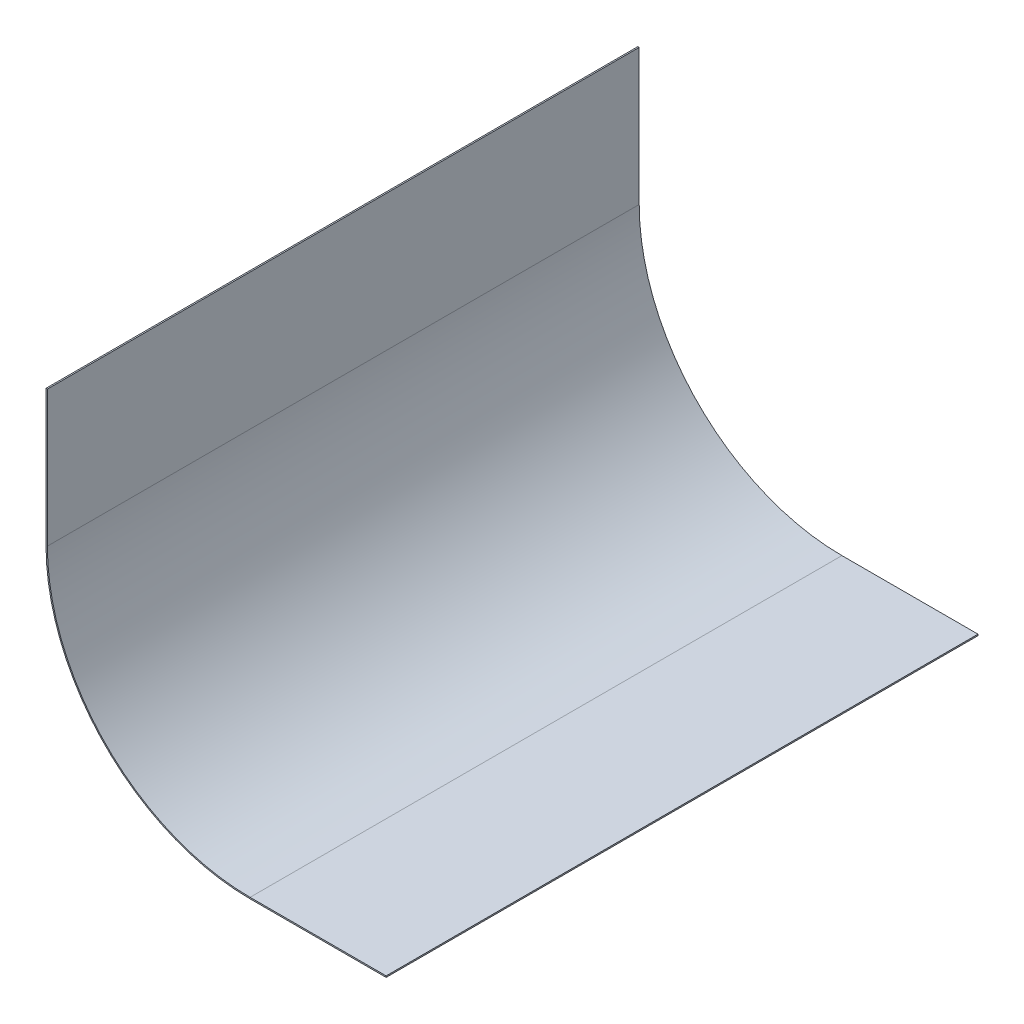
ISO-10303-21;
HEADER;
FILE_DESCRIPTION(('STEP AP214'),'2;1');
FILE_NAME('part.step','',(''),(''),'','','');
FILE_SCHEMA(('AUTOMOTIVE_DESIGN { 1 0 10303 214 1 1 1 1 }'));
ENDSEC;
DATA;
#1=APPLICATION_CONTEXT('core data for automotive mechanical design processes');
#2=APPLICATION_PROTOCOL_DEFINITION('international standard','automotive_design',2000,#1);
#3=PRODUCT_CONTEXT('',#1,'mechanical');
#4=PRODUCT('Part','Part','',(#3));
#5=PRODUCT_RELATED_PRODUCT_CATEGORY('part','',(#4));
#6=PRODUCT_DEFINITION_FORMATION('','',#4);
#7=PRODUCT_DEFINITION_CONTEXT('part definition',#1,'design');
#8=PRODUCT_DEFINITION('design','',#6,#7);
#9=PRODUCT_DEFINITION_SHAPE('','',#8);
#10=(LENGTH_UNIT() NAMED_UNIT(*) SI_UNIT(.MILLI.,.METRE.));
#11=(NAMED_UNIT(*) PLANE_ANGLE_UNIT() SI_UNIT($,.RADIAN.));
#12=(NAMED_UNIT(*) SI_UNIT($,.STERADIAN.) SOLID_ANGLE_UNIT());
#13=UNCERTAINTY_MEASURE_WITH_UNIT(LENGTH_MEASURE(1.E-05),#10,'distance_accuracy_value','');
#14=(GEOMETRIC_REPRESENTATION_CONTEXT(3) GLOBAL_UNCERTAINTY_ASSIGNED_CONTEXT((#13)) GLOBAL_UNIT_ASSIGNED_CONTEXT((#10,
#11,#12)) REPRESENTATION_CONTEXT('',''));
#15=CARTESIAN_POINT('',(0.,0.,0.));
#16=DIRECTION('',(0.,0.,1.));
#17=DIRECTION('',(1.,0.,0.));
#18=AXIS2_PLACEMENT_3D('',#15,#16,#17);
#19=CARTESIAN_POINT('',(-41.8969359331477,250.,490.));
#20=DIRECTION('',(0.,-1.,0.));
#21=DIRECTION('',(0.,0.,-1.));
#22=AXIS2_PLACEMENT_3D('',#19,#20,#21);
#23=PLANE('',#22);
#24=DIRECTION('',(-1.,0.,0.));
#25=VECTOR('',#24,1.);
#26=CARTESIAN_POINT('',(-41.8969359331477,250.,435.));
#27=LINE('',#26,#25);
#28=CARTESIAN_POINT('',(-41.8969359331477,250.,435.));
#29=VERTEX_POINT('',#28);
#30=CARTESIAN_POINT('',(-42.8969359331476,250.,435.));
#31=VERTEX_POINT('',#30);
#32=EDGE_CURVE('E98',#29,#31,#27,.T.);
#33=ORIENTED_EDGE('',*,*,#32,.F.);
#34=DIRECTION('',(0.,0.,-1.));
#35=VECTOR('',#34,1.);
#36=CARTESIAN_POINT('',(-41.8969359331477,250.,490.));
#37=LINE('',#36,#35);
#38=CARTESIAN_POINT('',(-41.8969359331477,250.,0.));
#39=VERTEX_POINT('',#38);
#40=EDGE_CURVE('E56',#29,#39,#37,.T.);
#41=ORIENTED_EDGE('',*,*,#40,.T.);
#42=DIRECTION('',(-1.,0.,0.));
#43=VECTOR('',#42,1.);
#44=CARTESIAN_POINT('',(-41.8969359331477,250.,0.));
#45=LINE('',#44,#43);
#46=CARTESIAN_POINT('',(-42.8969359331476,250.,0.));
#47=VERTEX_POINT('',#46);
#48=EDGE_CURVE('E103',#39,#47,#45,.T.);
#49=ORIENTED_EDGE('',*,*,#48,.T.);
#50=DIRECTION('',(0.,0.,-1.));
#51=VECTOR('',#50,1.);
#52=CARTESIAN_POINT('',(-42.8969359331476,250.,490.));
#53=LINE('',#52,#51);
#54=EDGE_CURVE('E42',#31,#47,#53,.T.);
#55=ORIENTED_EDGE('',*,*,#54,.F.);
#56=EDGE_LOOP('',(#33,#41,#49,#55));
#57=FACE_BOUND('',#56,.T.);
#58=ADVANCED_FACE('F35',(#57),#23,.F.);
#59=CARTESIAN_POINT('',(-42.8969359331476,250.,490.));
#60=DIRECTION('',(1.,0.,0.));
#61=DIRECTION('',(0.,1.,0.));
#62=AXIS2_PLACEMENT_3D('',#59,#60,#61);
#63=PLANE('',#62);
#64=DIRECTION('',(0.,-1.,0.));
#65=VECTOR('',#64,1.);
#66=CARTESIAN_POINT('',(-42.8969359331476,250.,435.));
#67=LINE('',#66,#65);
#68=CARTESIAN_POINT('',(-42.8969359331476,150.000000000001,435.));
#69=VERTEX_POINT('',#68);
#70=EDGE_CURVE('E104',#31,#69,#67,.T.);
#71=ORIENTED_EDGE('',*,*,#70,.F.);
#72=ORIENTED_EDGE('',*,*,#54,.T.);
#73=DIRECTION('',(0.,-1.,0.));
#74=VECTOR('',#73,1.);
#75=CARTESIAN_POINT('',(-42.8969359331476,250.,0.));
#76=LINE('',#75,#74);
#77=CARTESIAN_POINT('',(-42.8969359331476,150.000000000001,0.));
#78=VERTEX_POINT('',#77);
#79=EDGE_CURVE('E131',#47,#78,#76,.T.);
#80=ORIENTED_EDGE('',*,*,#79,.T.);
#81=DIRECTION('',(0.,0.,-1.));
#82=VECTOR('',#81,1.);
#83=CARTESIAN_POINT('',(-42.8969359331476,150.000000000001,490.));
#84=LINE('',#83,#82);
#85=EDGE_CURVE('E125',#69,#78,#84,.T.);
#86=ORIENTED_EDGE('',*,*,#85,.F.);
#87=EDGE_LOOP('',(#71,#72,#80,#86));
#88=FACE_BOUND('',#87,.T.);
#89=ADVANCED_FACE('F129',(#88),#63,.F.);
#90=CARTESIAN_POINT('',(107.103064066852,150.,490.));
#91=DIRECTION('',(0.,0.,-1.));
#92=DIRECTION('',(-1.,0.,0.));
#93=AXIS2_PLACEMENT_3D('',#90,#91,#92);
#94=CYLINDRICAL_SURFACE('',#93,150.);
#95=CARTESIAN_POINT('',(107.103064066852,150.,435.));
#96=DIRECTION('',(0.,0.,1.));
#97=DIRECTION('',(1.,0.,0.));
#98=AXIS2_PLACEMENT_3D('',#95,#96,#97);
#99=CIRCLE('',#98,150.);
#100=CARTESIAN_POINT('',(107.103064066853,0.,435.));
#101=VERTEX_POINT('',#100);
#102=EDGE_CURVE('E176',#69,#101,#99,.T.);
#103=ORIENTED_EDGE('',*,*,#102,.F.);
#104=ORIENTED_EDGE('',*,*,#85,.T.);
#105=CARTESIAN_POINT('',(107.103064066852,150.,0.));
#106=DIRECTION('',(0.,0.,1.));
#107=DIRECTION('',(-1.,0.,0.));
#108=AXIS2_PLACEMENT_3D('',#105,#106,#107);
#109=CIRCLE('',#108,150.);
#110=CARTESIAN_POINT('',(107.103064066853,0.,0.));
#111=VERTEX_POINT('',#110);
#112=EDGE_CURVE('E137',#78,#111,#109,.T.);
#113=ORIENTED_EDGE('',*,*,#112,.T.);
#114=DIRECTION('',(0.,0.,-1.));
#115=VECTOR('',#114,1.);
#116=CARTESIAN_POINT('',(107.103064066853,0.,490.));
#117=LINE('',#116,#115);
#118=EDGE_CURVE('E123',#101,#111,#117,.T.);
#119=ORIENTED_EDGE('',*,*,#118,.F.);
#120=EDGE_LOOP('',(#103,#104,#113,#119));
#121=FACE_BOUND('',#120,.T.);
#122=ADVANCED_FACE('F175',(#121),#94,.T.);
#123=CARTESIAN_POINT('',(107.103064066853,0.,490.));
#124=DIRECTION('',(0.,1.,0.));
#125=DIRECTION('',(0.,0.,1.));
#126=AXIS2_PLACEMENT_3D('',#123,#124,#125);
#127=PLANE('',#126);
#128=DIRECTION('',(1.,0.,0.));
#129=VECTOR('',#128,1.);
#130=CARTESIAN_POINT('',(107.103064066853,0.,435.));
#131=LINE('',#130,#129);
#132=CARTESIAN_POINT('',(207.103064066852,0.,435.));
#133=VERTEX_POINT('',#132);
#134=EDGE_CURVE('E172',#101,#133,#131,.T.);
#135=ORIENTED_EDGE('',*,*,#134,.F.);
#136=ORIENTED_EDGE('',*,*,#118,.T.);
#137=DIRECTION('',(1.,0.,0.));
#138=VECTOR('',#137,1.);
#139=CARTESIAN_POINT('',(107.103064066853,0.,0.));
#140=LINE('',#139,#138);
#141=CARTESIAN_POINT('',(207.103064066852,0.,0.));
#142=VERTEX_POINT('',#141);
#143=EDGE_CURVE('E143',#111,#142,#140,.T.);
#144=ORIENTED_EDGE('',*,*,#143,.T.);
#145=DIRECTION('',(0.,0.,-1.));
#146=VECTOR('',#145,1.);
#147=CARTESIAN_POINT('',(207.103064066852,0.,490.));
#148=LINE('',#147,#146);
#149=EDGE_CURVE('E121',#133,#142,#148,.T.);
#150=ORIENTED_EDGE('',*,*,#149,.F.);
#151=EDGE_LOOP('',(#135,#136,#144,#150));
#152=FACE_BOUND('',#151,.T.);
#153=ADVANCED_FACE('F170',(#152),#127,.F.);
#154=CARTESIAN_POINT('',(207.103064066852,0.999999999999999,490.));
#155=DIRECTION('',(-1.,0.,0.));
#156=DIRECTION('',(0.,-1.,0.));
#157=AXIS2_PLACEMENT_3D('',#154,#155,#156);
#158=PLANE('',#157);
#159=DIRECTION('',(0.,1.,0.));
#160=VECTOR('',#159,1.);
#161=CARTESIAN_POINT('',(207.103064066852,0.999999999999999,435.));
#162=LINE('',#161,#160);
#163=CARTESIAN_POINT('',(207.103064066852,0.999999999999999,435.));
#164=VERTEX_POINT('',#163);
#165=EDGE_CURVE('E167',#133,#164,#162,.T.);
#166=ORIENTED_EDGE('',*,*,#165,.F.);
#167=ORIENTED_EDGE('',*,*,#149,.T.);
#168=DIRECTION('',(0.,1.,0.));
#169=VECTOR('',#168,1.);
#170=CARTESIAN_POINT('',(207.103064066852,0.999999999999999,0.));
#171=LINE('',#170,#169);
#172=CARTESIAN_POINT('',(207.103064066852,0.999999999999999,0.));
#173=VERTEX_POINT('',#172);
#174=EDGE_CURVE('E146',#142,#173,#171,.T.);
#175=ORIENTED_EDGE('',*,*,#174,.T.);
#176=DIRECTION('',(0.,0.,-1.));
#177=VECTOR('',#176,1.);
#178=CARTESIAN_POINT('',(207.103064066852,0.999999999999999,490.));
#179=LINE('',#178,#177);
#180=EDGE_CURVE('E119',#164,#173,#179,.T.);
#181=ORIENTED_EDGE('',*,*,#180,.F.);
#182=EDGE_LOOP('',(#166,#167,#175,#181));
#183=FACE_BOUND('',#182,.T.);
#184=ADVANCED_FACE('F165',(#183),#158,.F.);
#185=CARTESIAN_POINT('',(107.103064066852,1.,490.));
#186=DIRECTION('',(0.,-1.,0.));
#187=DIRECTION('',(1.,0.,0.));
#188=AXIS2_PLACEMENT_3D('',#185,#186,#187);
#189=PLANE('',#188);
#190=DIRECTION('',(-1.,0.,0.));
#191=VECTOR('',#190,1.);
#192=CARTESIAN_POINT('',(107.103064066852,1.,435.));
#193=LINE('',#192,#191);
#194=CARTESIAN_POINT('',(107.103064066852,0.999999999999973,435.));
#195=VERTEX_POINT('',#194);
#196=EDGE_CURVE('E162',#164,#195,#193,.T.);
#197=ORIENTED_EDGE('',*,*,#196,.F.);
#198=ORIENTED_EDGE('',*,*,#180,.T.);
#199=DIRECTION('',(-1.,0.,0.));
#200=VECTOR('',#199,1.);
#201=CARTESIAN_POINT('',(107.103064066852,1.,0.));
#202=LINE('',#201,#200);
#203=CARTESIAN_POINT('',(107.103064066852,1.,0.));
#204=VERTEX_POINT('',#203);
#205=EDGE_CURVE('E149',#173,#204,#202,.T.);
#206=ORIENTED_EDGE('',*,*,#205,.T.);
#207=DIRECTION('',(0.,0.,-1.));
#208=VECTOR('',#207,1.);
#209=CARTESIAN_POINT('',(107.103064066852,1.,490.));
#210=LINE('',#209,#208);
#211=EDGE_CURVE('E112',#195,#204,#210,.T.);
#212=ORIENTED_EDGE('',*,*,#211,.F.);
#213=EDGE_LOOP('',(#197,#198,#206,#212));
#214=FACE_BOUND('',#213,.T.);
#215=ADVANCED_FACE('F160',(#214),#189,.F.);
#216=CARTESIAN_POINT('',(107.103064066852,150.,490.));
#217=DIRECTION('',(0.,0.,-1.));
#218=DIRECTION('',(-1.,0.,0.));
#219=AXIS2_PLACEMENT_3D('',#216,#217,#218);
#220=CYLINDRICAL_SURFACE('',#219,149.);
#221=CARTESIAN_POINT('',(107.103064066852,150.,435.));
#222=DIRECTION('',(0.,0.,1.));
#223=DIRECTION('',(1.,0.,0.));
#224=AXIS2_PLACEMENT_3D('',#221,#222,#223);
#225=CIRCLE('',#224,149.);
#226=CARTESIAN_POINT('',(-41.8969359331477,150.,435.));
#227=VERTEX_POINT('',#226);
#228=EDGE_CURVE('E48',#195,#227,#225,.F.);
#229=ORIENTED_EDGE('',*,*,#228,.F.);
#230=ORIENTED_EDGE('',*,*,#211,.T.);
#231=CARTESIAN_POINT('',(107.103064066852,150.,0.));
#232=DIRECTION('',(0.,0.,-1.));
#233=DIRECTION('',(-1.,0.,0.));
#234=AXIS2_PLACEMENT_3D('',#231,#232,#233);
#235=CIRCLE('',#234,149.);
#236=CARTESIAN_POINT('',(-41.8969359331477,150.,0.));
#237=VERTEX_POINT('',#236);
#238=EDGE_CURVE('E114',#204,#237,#235,.T.);
#239=ORIENTED_EDGE('',*,*,#238,.T.);
#240=DIRECTION('',(0.,0.,-1.));
#241=VECTOR('',#240,1.);
#242=CARTESIAN_POINT('',(-41.8969359331477,150.,490.));
#243=LINE('',#242,#241);
#244=EDGE_CURVE('E110',#227,#237,#243,.T.);
#245=ORIENTED_EDGE('',*,*,#244,.F.);
#246=EDGE_LOOP('',(#229,#230,#239,#245));
#247=FACE_BOUND('',#246,.T.);
#248=ADVANCED_FACE('F154',(#247),#220,.F.);
#249=CARTESIAN_POINT('',(-41.8969359331477,250.,490.));
#250=DIRECTION('',(-1.,0.,0.));
#251=DIRECTION('',(0.,-1.,0.));
#252=AXIS2_PLACEMENT_3D('',#249,#250,#251);
#253=PLANE('',#252);
#254=DIRECTION('',(0.,1.,0.));
#255=VECTOR('',#254,1.);
#256=CARTESIAN_POINT('',(-41.8969359331477,250.,435.));
#257=LINE('',#256,#255);
#258=EDGE_CURVE('E11',#227,#29,#257,.T.);
#259=ORIENTED_EDGE('',*,*,#258,.F.);
#260=ORIENTED_EDGE('',*,*,#244,.T.);
#261=DIRECTION('',(0.,1.,0.));
#262=VECTOR('',#261,1.);
#263=CARTESIAN_POINT('',(-41.8969359331477,250.,0.));
#264=LINE('',#263,#262);
#265=EDGE_CURVE('E108',#237,#39,#264,.T.);
#266=ORIENTED_EDGE('',*,*,#265,.T.);
#267=ORIENTED_EDGE('',*,*,#40,.F.);
#268=EDGE_LOOP('',(#259,#260,#266,#267));
#269=FACE_BOUND('',#268,.T.);
#270=ADVANCED_FACE('F106',(#269),#253,.F.);
#271=CARTESIAN_POINT('',(107.103064066852,150.,0.));
#272=DIRECTION('',(0.,0.,-1.));
#273=DIRECTION('',(-1.,0.,0.));
#274=AXIS2_PLACEMENT_3D('',#271,#272,#273);
#275=PLANE('',#274);
#276=ORIENTED_EDGE('',*,*,#48,.F.);
#277=ORIENTED_EDGE('',*,*,#265,.F.);
#278=ORIENTED_EDGE('',*,*,#238,.F.);
#279=ORIENTED_EDGE('',*,*,#205,.F.);
#280=ORIENTED_EDGE('',*,*,#174,.F.);
#281=ORIENTED_EDGE('',*,*,#143,.F.);
#282=ORIENTED_EDGE('',*,*,#112,.F.);
#283=ORIENTED_EDGE('',*,*,#79,.F.);
#284=EDGE_LOOP('',(#276,#277,#278,#279,#280,#281,#282,#283));
#285=FACE_BOUND('',#284,.T.);
#286=ADVANCED_FACE('F134',(#285),#275,.T.);
#287=CARTESIAN_POINT('',(0.,0.,435.));
#288=DIRECTION('',(0.,0.,1.));
#289=DIRECTION('',(1.,0.,0.));
#290=AXIS2_PLACEMENT_3D('',#287,#288,#289);
#291=PLANE('',#290);
#292=ORIENTED_EDGE('',*,*,#32,.T.);
#293=ORIENTED_EDGE('',*,*,#70,.T.);
#294=ORIENTED_EDGE('',*,*,#102,.T.);
#295=ORIENTED_EDGE('',*,*,#134,.T.);
#296=ORIENTED_EDGE('',*,*,#165,.T.);
#297=ORIENTED_EDGE('',*,*,#196,.T.);
#298=ORIENTED_EDGE('',*,*,#228,.T.);
#299=ORIENTED_EDGE('',*,*,#258,.T.);
#300=EDGE_LOOP('',(#292,#293,#294,#295,#296,#297,#298,#299));
#301=FACE_BOUND('',#300,.T.);
#302=ADVANCED_FACE('F97',(#301),#291,.T.);
#303=CLOSED_SHELL('',(#58,#89,#122,#153,#184,#215,#248,#270,#286,#302));
#304=MANIFOLD_SOLID_BREP('B2',#303);
#305=ADVANCED_BREP_SHAPE_REPRESENTATION('',(#18,#304),#14);
#306=SHAPE_DEFINITION_REPRESENTATION(#9,#305);
ENDSEC;
END-ISO-10303-21;
